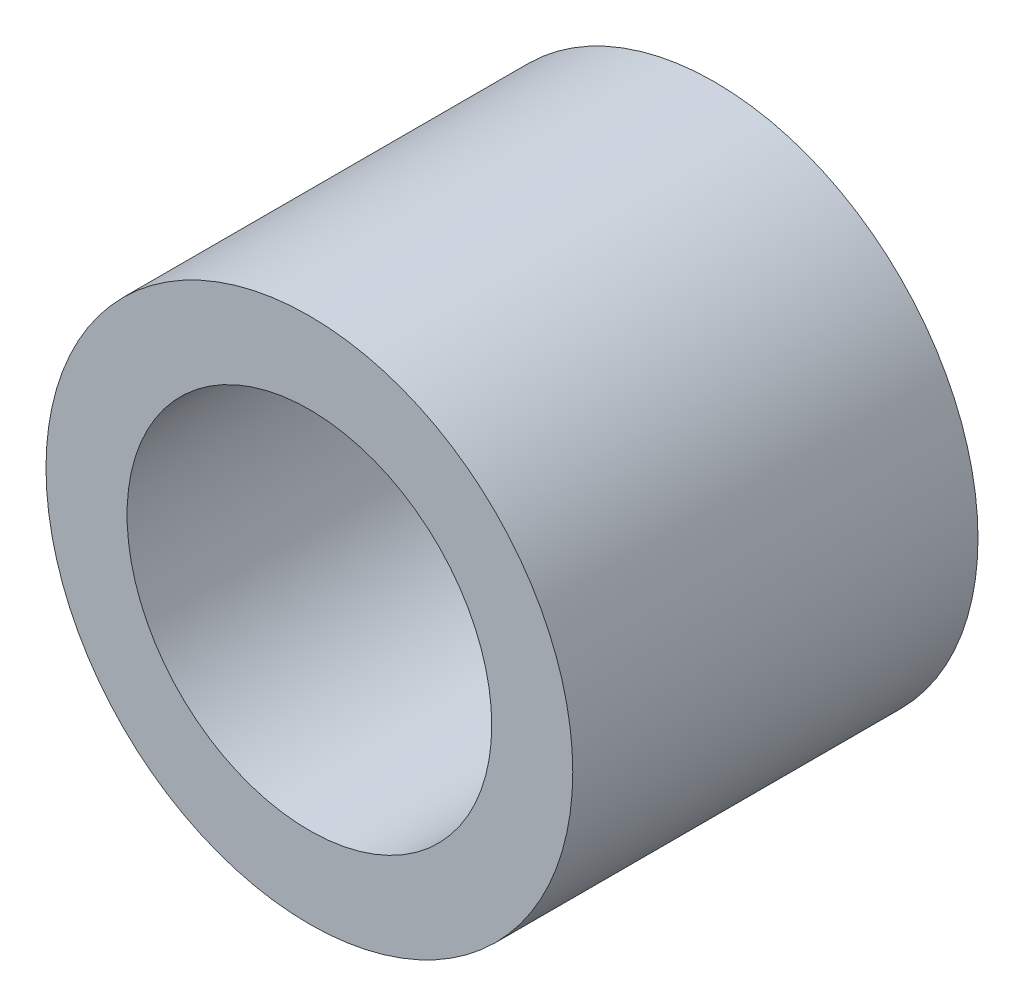
ISO-10303-21;
HEADER;
FILE_DESCRIPTION(('STEP AP214'),'2;1');
FILE_NAME('part.step','',(''),(''),'','','');
FILE_SCHEMA(('AUTOMOTIVE_DESIGN { 1 0 10303 214 1 1 1 1 }'));
ENDSEC;
DATA;
#1=APPLICATION_CONTEXT('core data for automotive mechanical design processes');
#2=APPLICATION_PROTOCOL_DEFINITION('international standard','automotive_design',2000,#1);
#3=PRODUCT_CONTEXT('',#1,'mechanical');
#4=PRODUCT('Part','Part','',(#3));
#5=PRODUCT_RELATED_PRODUCT_CATEGORY('part','',(#4));
#6=PRODUCT_DEFINITION_FORMATION('','',#4);
#7=PRODUCT_DEFINITION_CONTEXT('part definition',#1,'design');
#8=PRODUCT_DEFINITION('design','',#6,#7);
#9=PRODUCT_DEFINITION_SHAPE('','',#8);
#10=(LENGTH_UNIT() NAMED_UNIT(*) SI_UNIT(.MILLI.,.METRE.));
#11=(NAMED_UNIT(*) PLANE_ANGLE_UNIT() SI_UNIT($,.RADIAN.));
#12=(NAMED_UNIT(*) SI_UNIT($,.STERADIAN.) SOLID_ANGLE_UNIT());
#13=UNCERTAINTY_MEASURE_WITH_UNIT(LENGTH_MEASURE(1.E-05),#10,'distance_accuracy_value','');
#14=(GEOMETRIC_REPRESENTATION_CONTEXT(3) GLOBAL_UNCERTAINTY_ASSIGNED_CONTEXT((#13)) GLOBAL_UNIT_ASSIGNED_CONTEXT((#10,
#11,#12)) REPRESENTATION_CONTEXT('',''));
#15=CARTESIAN_POINT('',(0.,0.,0.));
#16=DIRECTION('',(0.,0.,1.));
#17=DIRECTION('',(1.,0.,0.));
#18=AXIS2_PLACEMENT_3D('',#15,#16,#17);
#19=CARTESIAN_POINT('',(0.,0.,10.));
#20=DIRECTION('',(0.,0.,1.));
#21=DIRECTION('',(1.,0.,0.));
#22=AXIS2_PLACEMENT_3D('',#19,#20,#21);
#23=PLANE('',#22);
#24=CARTESIAN_POINT('',(0.,0.,10.));
#25=DIRECTION('',(0.,0.,1.));
#26=DIRECTION('',(1.,0.,0.));
#27=AXIS2_PLACEMENT_3D('',#24,#25,#26);
#28=CIRCLE('',#27,9.);
#29=CARTESIAN_POINT('',(9.,0.,10.));
#30=VERTEX_POINT('',#29);
#31=EDGE_CURVE('E27',#30,#30,#28,.T.);
#32=ORIENTED_EDGE('',*,*,#31,.F.);
#33=EDGE_LOOP('',(#32));
#34=FACE_BOUND('',#33,.T.);
#35=CARTESIAN_POINT('',(0.,0.,10.));
#36=DIRECTION('',(0.,0.,-1.));
#37=DIRECTION('',(-1.,0.,0.));
#38=AXIS2_PLACEMENT_3D('',#35,#36,#37);
#39=CIRCLE('',#38,13.);
#40=CARTESIAN_POINT('',(-13.,0.,10.));
#41=VERTEX_POINT('',#40);
#42=EDGE_CURVE('E9',#41,#41,#39,.T.);
#43=ORIENTED_EDGE('',*,*,#42,.F.);
#44=EDGE_LOOP('',(#43));
#45=FACE_BOUND('',#44,.T.);
#46=ADVANCED_FACE('F14',(#34,#45),#23,.T.);
#47=CARTESIAN_POINT('',(0.,0.,-10.));
#48=DIRECTION('',(0.,0.,-1.));
#49=DIRECTION('',(-1.,0.,0.));
#50=AXIS2_PLACEMENT_3D('',#47,#48,#49);
#51=PLANE('',#50);
#52=CARTESIAN_POINT('',(0.,0.,-10.));
#53=DIRECTION('',(0.,0.,-1.));
#54=DIRECTION('',(-1.,0.,0.));
#55=AXIS2_PLACEMENT_3D('',#52,#53,#54);
#56=CIRCLE('',#55,9.);
#57=CARTESIAN_POINT('',(-9.,0.,-10.));
#58=VERTEX_POINT('',#57);
#59=EDGE_CURVE('E18',#58,#58,#56,.T.);
#60=ORIENTED_EDGE('',*,*,#59,.F.);
#61=EDGE_LOOP('',(#60));
#62=FACE_BOUND('',#61,.T.);
#63=CARTESIAN_POINT('',(0.,0.,-10.));
#64=DIRECTION('',(0.,0.,1.));
#65=DIRECTION('',(1.,0.,0.));
#66=AXIS2_PLACEMENT_3D('',#63,#64,#65);
#67=CIRCLE('',#66,13.);
#68=CARTESIAN_POINT('',(13.,0.,-10.));
#69=VERTEX_POINT('',#68);
#70=EDGE_CURVE('E22',#69,#69,#67,.T.);
#71=ORIENTED_EDGE('',*,*,#70,.F.);
#72=EDGE_LOOP('',(#71));
#73=FACE_BOUND('',#72,.T.);
#74=ADVANCED_FACE('F40',(#62,#73),#51,.T.);
#75=CARTESIAN_POINT('',(0.,0.,-10.));
#76=DIRECTION('',(0.,0.,1.));
#77=DIRECTION('',(1.,0.,0.));
#78=AXIS2_PLACEMENT_3D('',#75,#76,#77);
#79=CYLINDRICAL_SURFACE('',#78,13.);
#80=ORIENTED_EDGE('',*,*,#42,.T.);
#81=EDGE_LOOP('',(#80));
#82=FACE_BOUND('',#81,.T.);
#83=ORIENTED_EDGE('',*,*,#70,.T.);
#84=EDGE_LOOP('',(#83));
#85=FACE_BOUND('',#84,.T.);
#86=ADVANCED_FACE('F16',(#82,#85),#79,.T.);
#87=CARTESIAN_POINT('',(0.,0.,-11.));
#88=DIRECTION('',(0.,0.,1.));
#89=DIRECTION('',(1.,0.,0.));
#90=AXIS2_PLACEMENT_3D('',#87,#88,#89);
#91=CYLINDRICAL_SURFACE('',#90,9.);
#92=ORIENTED_EDGE('',*,*,#31,.T.);
#93=EDGE_LOOP('',(#92));
#94=FACE_BOUND('',#93,.T.);
#95=ORIENTED_EDGE('',*,*,#59,.T.);
#96=EDGE_LOOP('',(#95));
#97=FACE_BOUND('',#96,.T.);
#98=ADVANCED_FACE('F34',(#94,#97),#91,.F.);
#99=CLOSED_SHELL('',(#46,#74,#86,#98));
#100=MANIFOLD_SOLID_BREP('B1',#99);
#101=ADVANCED_BREP_SHAPE_REPRESENTATION('',(#18,#100),#14);
#102=SHAPE_DEFINITION_REPRESENTATION(#9,#101);
ENDSEC;
END-ISO-10303-21;
